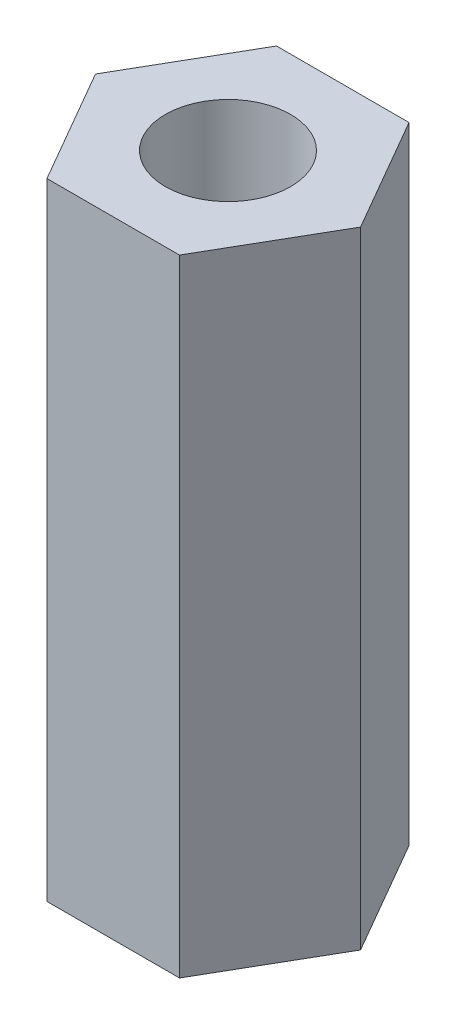
ISO-10303-21;
HEADER;
FILE_DESCRIPTION(('STEP AP214'),'2;1');
FILE_NAME('part.step','',(''),(''),'','','');
FILE_SCHEMA(('AUTOMOTIVE_DESIGN { 1 0 10303 214 1 1 1 1 }'));
ENDSEC;
DATA;
#1=APPLICATION_CONTEXT('core data for automotive mechanical design processes');
#2=APPLICATION_PROTOCOL_DEFINITION('international standard','automotive_design',2000,#1);
#3=PRODUCT_CONTEXT('',#1,'mechanical');
#4=PRODUCT('Part','Part','',(#3));
#5=PRODUCT_RELATED_PRODUCT_CATEGORY('part','',(#4));
#6=PRODUCT_DEFINITION_FORMATION('','',#4);
#7=PRODUCT_DEFINITION_CONTEXT('part definition',#1,'design');
#8=PRODUCT_DEFINITION('design','',#6,#7);
#9=PRODUCT_DEFINITION_SHAPE('','',#8);
#10=(LENGTH_UNIT() NAMED_UNIT(*) SI_UNIT(.MILLI.,.METRE.));
#11=(NAMED_UNIT(*) PLANE_ANGLE_UNIT() SI_UNIT($,.RADIAN.));
#12=(NAMED_UNIT(*) SI_UNIT($,.STERADIAN.) SOLID_ANGLE_UNIT());
#13=UNCERTAINTY_MEASURE_WITH_UNIT(LENGTH_MEASURE(1.E-05),#10,'distance_accuracy_value','');
#14=(GEOMETRIC_REPRESENTATION_CONTEXT(3) GLOBAL_UNCERTAINTY_ASSIGNED_CONTEXT((#13)) GLOBAL_UNIT_ASSIGNED_CONTEXT((#10,
#11,#12)) REPRESENTATION_CONTEXT('',''));
#15=CARTESIAN_POINT('',(0.,0.,0.));
#16=DIRECTION('',(0.,0.,1.));
#17=DIRECTION('',(1.,0.,0.));
#18=AXIS2_PLACEMENT_3D('',#15,#16,#17);
#19=CARTESIAN_POINT('',(0.,15.,0.));
#20=DIRECTION('',(0.,1.,0.));
#21=DIRECTION('',(0.,0.,1.));
#22=AXIS2_PLACEMENT_3D('',#19,#20,#21);
#23=PLANE('',#22);
#24=DIRECTION('',(-1.,0.,0.));
#25=VECTOR('',#24,1.);
#26=CARTESIAN_POINT('',(1.58771324027147,15.,-2.75));
#27=LINE('',#26,#25);
#28=CARTESIAN_POINT('',(1.58771324027147,15.,-2.75));
#29=VERTEX_POINT('',#28);
#30=CARTESIAN_POINT('',(-1.58771324027147,15.,-2.75));
#31=VERTEX_POINT('',#30);
#32=EDGE_CURVE('E130',#29,#31,#27,.T.);
#33=ORIENTED_EDGE('',*,*,#32,.T.);
#34=DIRECTION('',(-0.5,0.,0.866025403784438));
#35=VECTOR('',#34,1.);
#36=CARTESIAN_POINT('',(-1.58771324027147,15.,-2.75));
#37=LINE('',#36,#35);
#38=CARTESIAN_POINT('',(-3.17542648054294,15.,0.));
#39=VERTEX_POINT('',#38);
#40=EDGE_CURVE('E88',#31,#39,#37,.T.);
#41=ORIENTED_EDGE('',*,*,#40,.T.);
#42=DIRECTION('',(0.5,0.,0.866025403784439));
#43=VECTOR('',#42,1.);
#44=CARTESIAN_POINT('',(-3.17542648054294,15.,0.));
#45=LINE('',#44,#43);
#46=CARTESIAN_POINT('',(-1.58771324027147,15.,2.75));
#47=VERTEX_POINT('',#46);
#48=EDGE_CURVE('E101',#39,#47,#45,.T.);
#49=ORIENTED_EDGE('',*,*,#48,.T.);
#50=DIRECTION('',(1.,0.,0.));
#51=VECTOR('',#50,1.);
#52=CARTESIAN_POINT('',(-1.58771324027147,15.,2.75));
#53=LINE('',#52,#51);
#54=CARTESIAN_POINT('',(1.58771324027147,15.,2.75));
#55=VERTEX_POINT('',#54);
#56=EDGE_CURVE('E95',#47,#55,#53,.T.);
#57=ORIENTED_EDGE('',*,*,#56,.T.);
#58=DIRECTION('',(0.5,0.,-0.866025403784439));
#59=VECTOR('',#58,1.);
#60=CARTESIAN_POINT('',(1.58771324027147,15.,2.75));
#61=LINE('',#60,#59);
#62=CARTESIAN_POINT('',(3.17542648054294,15.,0.));
#63=VERTEX_POINT('',#62);
#64=EDGE_CURVE('E99',#55,#63,#61,.T.);
#65=ORIENTED_EDGE('',*,*,#64,.T.);
#66=DIRECTION('',(-0.5,0.,-0.866025403784439));
#67=VECTOR('',#66,1.);
#68=CARTESIAN_POINT('',(3.17542648054294,15.,0.));
#69=LINE('',#68,#67);
#70=EDGE_CURVE('E51',#63,#29,#69,.T.);
#71=ORIENTED_EDGE('',*,*,#70,.T.);
#72=EDGE_LOOP('',(#33,#41,#49,#57,#65,#71));
#73=FACE_BOUND('',#72,.T.);
#74=CARTESIAN_POINT('',(0.,15.,0.));
#75=DIRECTION('',(0.,1.,0.));
#76=DIRECTION('',(0.,0.,1.));
#77=AXIS2_PLACEMENT_3D('',#74,#75,#76);
#78=CIRCLE('',#77,1.5);
#79=CARTESIAN_POINT('',(0.,15.,1.5));
#80=VERTEX_POINT('',#79);
#81=EDGE_CURVE('E123',#80,#80,#78,.T.);
#82=ORIENTED_EDGE('',*,*,#81,.F.);
#83=EDGE_LOOP('',(#82));
#84=FACE_BOUND('',#83,.T.);
#85=ADVANCED_FACE('F34',(#73,#84),#23,.T.);
#86=CARTESIAN_POINT('',(0.,0.,0.));
#87=DIRECTION('',(0.,1.,0.));
#88=DIRECTION('',(0.,0.,1.));
#89=AXIS2_PLACEMENT_3D('',#86,#87,#88);
#90=PLANE('',#89);
#91=DIRECTION('',(-1.,0.,0.));
#92=VECTOR('',#91,1.);
#93=CARTESIAN_POINT('',(1.58771324027147,0.,-2.75));
#94=LINE('',#93,#92);
#95=CARTESIAN_POINT('',(1.58771324027147,0.,-2.75));
#96=VERTEX_POINT('',#95);
#97=CARTESIAN_POINT('',(-1.58771324027147,0.,-2.75));
#98=VERTEX_POINT('',#97);
#99=EDGE_CURVE('E119',#96,#98,#94,.T.);
#100=ORIENTED_EDGE('',*,*,#99,.F.);
#101=DIRECTION('',(-0.5,0.,-0.866025403784439));
#102=VECTOR('',#101,1.);
#103=CARTESIAN_POINT('',(3.17542648054294,0.,0.));
#104=LINE('',#103,#102);
#105=CARTESIAN_POINT('',(3.17542648054294,0.,0.));
#106=VERTEX_POINT('',#105);
#107=EDGE_CURVE('E80',#106,#96,#104,.T.);
#108=ORIENTED_EDGE('',*,*,#107,.F.);
#109=DIRECTION('',(0.5,0.,-0.866025403784439));
#110=VECTOR('',#109,1.);
#111=CARTESIAN_POINT('',(1.58771324027147,0.,2.75));
#112=LINE('',#111,#110);
#113=CARTESIAN_POINT('',(1.58771324027147,0.,2.75));
#114=VERTEX_POINT('',#113);
#115=EDGE_CURVE('E74',#114,#106,#112,.T.);
#116=ORIENTED_EDGE('',*,*,#115,.F.);
#117=DIRECTION('',(1.,0.,0.));
#118=VECTOR('',#117,1.);
#119=CARTESIAN_POINT('',(-1.58771324027147,0.,2.75));
#120=LINE('',#119,#118);
#121=CARTESIAN_POINT('',(-1.58771324027147,0.,2.75));
#122=VERTEX_POINT('',#121);
#123=EDGE_CURVE('E109',#122,#114,#120,.T.);
#124=ORIENTED_EDGE('',*,*,#123,.F.);
#125=DIRECTION('',(0.5,0.,0.866025403784439));
#126=VECTOR('',#125,1.);
#127=CARTESIAN_POINT('',(-3.17542648054294,0.,0.));
#128=LINE('',#127,#126);
#129=CARTESIAN_POINT('',(-3.17542648054294,0.,0.));
#130=VERTEX_POINT('',#129);
#131=EDGE_CURVE('E125',#130,#122,#128,.T.);
#132=ORIENTED_EDGE('',*,*,#131,.F.);
#133=DIRECTION('',(-0.5,0.,0.866025403784438));
#134=VECTOR('',#133,1.);
#135=CARTESIAN_POINT('',(-1.58771324027147,0.,-2.75));
#136=LINE('',#135,#134);
#137=EDGE_CURVE('E122',#98,#130,#136,.T.);
#138=ORIENTED_EDGE('',*,*,#137,.F.);
#139=EDGE_LOOP('',(#100,#108,#116,#124,#132,#138));
#140=FACE_BOUND('',#139,.T.);
#141=CARTESIAN_POINT('',(0.,0.,0.));
#142=DIRECTION('',(0.,1.,0.));
#143=DIRECTION('',(0.,0.,1.));
#144=AXIS2_PLACEMENT_3D('',#141,#142,#143);
#145=CIRCLE('',#144,1.5);
#146=CARTESIAN_POINT('',(0.,0.,1.5));
#147=VERTEX_POINT('',#146);
#148=EDGE_CURVE('E223',#147,#147,#145,.T.);
#149=ORIENTED_EDGE('',*,*,#148,.T.);
#150=EDGE_LOOP('',(#149));
#151=FACE_BOUND('',#150,.T.);
#152=ADVANCED_FACE('F139',(#140,#151),#90,.F.);
#153=CARTESIAN_POINT('',(1.58771324027147,15.,-2.75));
#154=DIRECTION('',(0.,0.,1.));
#155=DIRECTION('',(1.,0.,0.));
#156=AXIS2_PLACEMENT_3D('',#153,#154,#155);
#157=PLANE('',#156);
#158=ORIENTED_EDGE('',*,*,#99,.T.);
#159=DIRECTION('',(0.,-1.,0.));
#160=VECTOR('',#159,1.);
#161=CARTESIAN_POINT('',(-1.58771324027147,15.,-2.75));
#162=LINE('',#161,#160);
#163=EDGE_CURVE('E11',#31,#98,#162,.T.);
#164=ORIENTED_EDGE('',*,*,#163,.F.);
#165=ORIENTED_EDGE('',*,*,#32,.F.);
#166=DIRECTION('',(0.,-1.,0.));
#167=VECTOR('',#166,1.);
#168=CARTESIAN_POINT('',(1.58771324027147,15.,-2.75));
#169=LINE('',#168,#167);
#170=EDGE_CURVE('E115',#29,#96,#169,.T.);
#171=ORIENTED_EDGE('',*,*,#170,.T.);
#172=EDGE_LOOP('',(#158,#164,#165,#171));
#173=FACE_BOUND('',#172,.T.);
#174=ADVANCED_FACE('F36',(#173),#157,.F.);
#175=CARTESIAN_POINT('',(-1.58771324027147,15.,-2.75));
#176=DIRECTION('',(0.866025403784438,0.,0.5));
#177=DIRECTION('',(0.5,0.,-0.866025403784438));
#178=AXIS2_PLACEMENT_3D('',#175,#176,#177);
#179=PLANE('',#178);
#180=ORIENTED_EDGE('',*,*,#137,.T.);
#181=DIRECTION('',(0.,-1.,0.));
#182=VECTOR('',#181,1.);
#183=CARTESIAN_POINT('',(-3.17542648054294,15.,0.));
#184=LINE('',#183,#182);
#185=EDGE_CURVE('E43',#39,#130,#184,.T.);
#186=ORIENTED_EDGE('',*,*,#185,.F.);
#187=ORIENTED_EDGE('',*,*,#40,.F.);
#188=ORIENTED_EDGE('',*,*,#163,.T.);
#189=EDGE_LOOP('',(#180,#186,#187,#188));
#190=FACE_BOUND('',#189,.T.);
#191=ADVANCED_FACE('F164',(#190),#179,.F.);
#192=CARTESIAN_POINT('',(-3.17542648054294,15.,0.));
#193=DIRECTION('',(0.866025403784439,0.,-0.5));
#194=DIRECTION('',(-0.5,0.,-0.866025403784439));
#195=AXIS2_PLACEMENT_3D('',#192,#193,#194);
#196=PLANE('',#195);
#197=ORIENTED_EDGE('',*,*,#131,.T.);
#198=DIRECTION('',(0.,-1.,0.));
#199=VECTOR('',#198,1.);
#200=CARTESIAN_POINT('',(-1.58771324027147,15.,2.75));
#201=LINE('',#200,#199);
#202=EDGE_CURVE('E110',#47,#122,#201,.T.);
#203=ORIENTED_EDGE('',*,*,#202,.F.);
#204=ORIENTED_EDGE('',*,*,#48,.F.);
#205=ORIENTED_EDGE('',*,*,#185,.T.);
#206=EDGE_LOOP('',(#197,#203,#204,#205));
#207=FACE_BOUND('',#206,.T.);
#208=ADVANCED_FACE('F136',(#207),#196,.F.);
#209=CARTESIAN_POINT('',(-1.58771324027147,15.,2.75));
#210=DIRECTION('',(0.,0.,-1.));
#211=DIRECTION('',(-1.,0.,0.));
#212=AXIS2_PLACEMENT_3D('',#209,#210,#211);
#213=PLANE('',#212);
#214=ORIENTED_EDGE('',*,*,#123,.T.);
#215=DIRECTION('',(0.,-1.,0.));
#216=VECTOR('',#215,1.);
#217=CARTESIAN_POINT('',(1.58771324027147,15.,2.75));
#218=LINE('',#217,#216);
#219=EDGE_CURVE('E106',#55,#114,#218,.T.);
#220=ORIENTED_EDGE('',*,*,#219,.F.);
#221=ORIENTED_EDGE('',*,*,#56,.F.);
#222=ORIENTED_EDGE('',*,*,#202,.T.);
#223=EDGE_LOOP('',(#214,#220,#221,#222));
#224=FACE_BOUND('',#223,.T.);
#225=ADVANCED_FACE('F107',(#224),#213,.F.);
#226=CARTESIAN_POINT('',(1.58771324027147,15.,2.75));
#227=DIRECTION('',(-0.866025403784439,0.,-0.5));
#228=DIRECTION('',(-0.5,0.,0.866025403784439));
#229=AXIS2_PLACEMENT_3D('',#226,#227,#228);
#230=PLANE('',#229);
#231=ORIENTED_EDGE('',*,*,#115,.T.);
#232=DIRECTION('',(0.,-1.,0.));
#233=VECTOR('',#232,1.);
#234=CARTESIAN_POINT('',(3.17542648054294,15.,0.));
#235=LINE('',#234,#233);
#236=EDGE_CURVE('E111',#63,#106,#235,.T.);
#237=ORIENTED_EDGE('',*,*,#236,.F.);
#238=ORIENTED_EDGE('',*,*,#64,.F.);
#239=ORIENTED_EDGE('',*,*,#219,.T.);
#240=EDGE_LOOP('',(#231,#237,#238,#239));
#241=FACE_BOUND('',#240,.T.);
#242=ADVANCED_FACE('F113',(#241),#230,.F.);
#243=CARTESIAN_POINT('',(3.17542648054294,15.,0.));
#244=DIRECTION('',(-0.866025403784439,0.,0.5));
#245=DIRECTION('',(0.5,0.,0.866025403784439));
#246=AXIS2_PLACEMENT_3D('',#243,#244,#245);
#247=PLANE('',#246);
#248=ORIENTED_EDGE('',*,*,#107,.T.);
#249=ORIENTED_EDGE('',*,*,#170,.F.);
#250=ORIENTED_EDGE('',*,*,#70,.F.);
#251=ORIENTED_EDGE('',*,*,#236,.T.);
#252=EDGE_LOOP('',(#248,#249,#250,#251));
#253=FACE_BOUND('',#252,.T.);
#254=ADVANCED_FACE('F144',(#253),#247,.F.);
#255=CARTESIAN_POINT('',(0.,15.,0.));
#256=DIRECTION('',(0.,-1.,0.));
#257=DIRECTION('',(0.,0.,-1.));
#258=AXIS2_PLACEMENT_3D('',#255,#256,#257);
#259=CYLINDRICAL_SURFACE('',#258,1.5);
#260=ORIENTED_EDGE('',*,*,#81,.T.);
#261=EDGE_LOOP('',(#260));
#262=FACE_BOUND('',#261,.T.);
#263=ORIENTED_EDGE('',*,*,#148,.F.);
#264=EDGE_LOOP('',(#263));
#265=FACE_BOUND('',#264,.T.);
#266=ADVANCED_FACE('F146',(#262,#265),#259,.F.);
#267=CLOSED_SHELL('',(#85,#152,#174,#191,#208,#225,#242,#254,#266));
#268=MANIFOLD_SOLID_BREP('B2',#267);
#269=ADVANCED_BREP_SHAPE_REPRESENTATION('',(#18,#268),#14);
#270=SHAPE_DEFINITION_REPRESENTATION(#9,#269);
ENDSEC;
END-ISO-10303-21;
